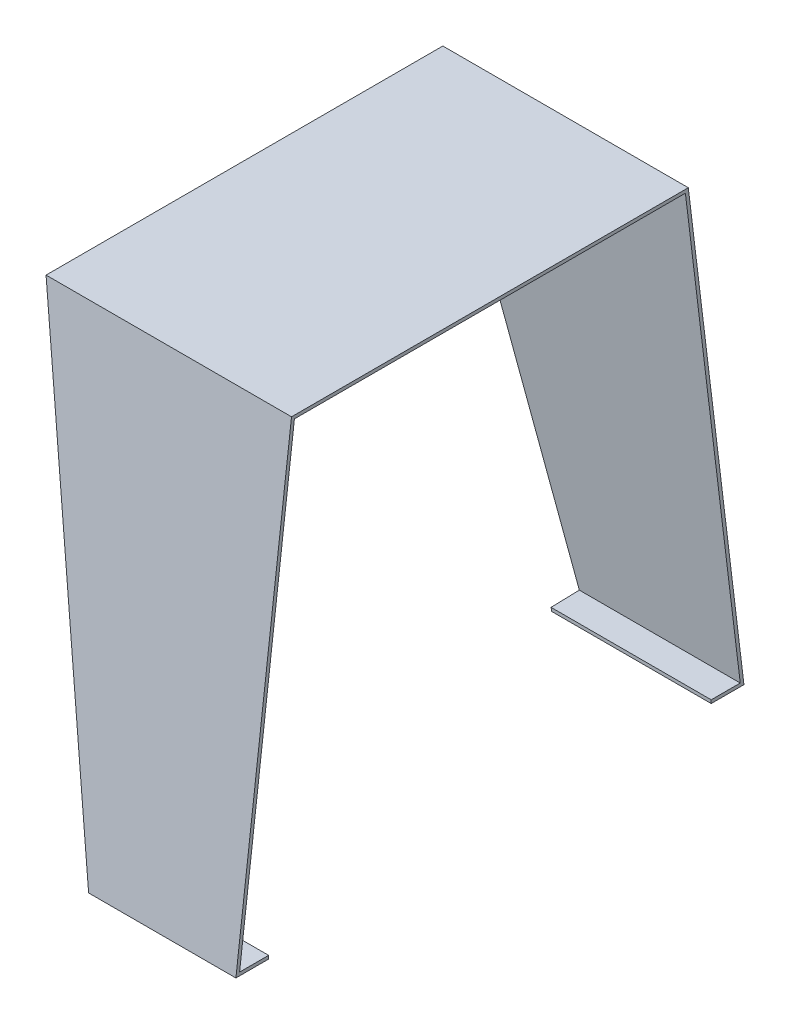
ISO-10303-21;
HEADER;
FILE_DESCRIPTION(('STEP AP214'),'2;1');
FILE_NAME('part.step','',(''),(''),'','','');
FILE_SCHEMA(('AUTOMOTIVE_DESIGN { 1 0 10303 214 1 1 1 1 }'));
ENDSEC;
DATA;
#1=APPLICATION_CONTEXT('core data for automotive mechanical design processes');
#2=APPLICATION_PROTOCOL_DEFINITION('international standard','automotive_design',2000,#1);
#3=PRODUCT_CONTEXT('',#1,'mechanical');
#4=PRODUCT('Part','Part','',(#3));
#5=PRODUCT_RELATED_PRODUCT_CATEGORY('part','',(#4));
#6=PRODUCT_DEFINITION_FORMATION('','',#4);
#7=PRODUCT_DEFINITION_CONTEXT('part definition',#1,'design');
#8=PRODUCT_DEFINITION('design','',#6,#7);
#9=PRODUCT_DEFINITION_SHAPE('','',#8);
#10=(LENGTH_UNIT() NAMED_UNIT(*) SI_UNIT(.MILLI.,.METRE.));
#11=(NAMED_UNIT(*) PLANE_ANGLE_UNIT() SI_UNIT($,.RADIAN.));
#12=(NAMED_UNIT(*) SI_UNIT($,.STERADIAN.) SOLID_ANGLE_UNIT());
#13=UNCERTAINTY_MEASURE_WITH_UNIT(LENGTH_MEASURE(1.E-05),#10,'distance_accuracy_value','');
#14=(GEOMETRIC_REPRESENTATION_CONTEXT(3) GLOBAL_UNCERTAINTY_ASSIGNED_CONTEXT((#13)) GLOBAL_UNIT_ASSIGNED_CONTEXT((#10,
#11,#12)) REPRESENTATION_CONTEXT('',''));
#15=CARTESIAN_POINT('',(0.,0.,0.));
#16=DIRECTION('',(0.,0.,1.));
#17=DIRECTION('',(1.,0.,0.));
#18=AXIS2_PLACEMENT_3D('',#15,#16,#17);
#19=CARTESIAN_POINT('',(150.,-280.,34.));
#20=DIRECTION('',(0.,1.,0.));
#21=DIRECTION('',(0.,0.,1.));
#22=AXIS2_PLACEMENT_3D('',#19,#20,#21);
#23=PLANE('',#22);
#24=DIRECTION('',(0.,0.,-1.));
#25=VECTOR('',#24,1.);
#26=CARTESIAN_POINT('',(150.,-280.,34.));
#27=LINE('',#26,#25);
#28=CARTESIAN_POINT('',(150.,-280.,-256.46));
#29=VERTEX_POINT('',#28);
#30=CARTESIAN_POINT('',(150.,-280.,-276.46));
#31=VERTEX_POINT('',#30);
#32=EDGE_CURVE('E184',#29,#31,#27,.T.);
#33=ORIENTED_EDGE('',*,*,#32,.F.);
#34=DIRECTION('',(1.,0.,0.));
#35=VECTOR('',#34,1.);
#36=CARTESIAN_POINT('',(0.,-280.,-256.46));
#37=LINE('',#36,#35);
#38=CARTESIAN_POINT('',(52.5519332294233,-280.,-256.46));
#39=VERTEX_POINT('',#38);
#40=EDGE_CURVE('E137',#39,#29,#37,.T.);
#41=ORIENTED_EDGE('',*,*,#40,.F.);
#42=DIRECTION('',(-0.0256338887285018,0.,-0.999671397884652));
#43=VECTOR('',#42,1.);
#44=CARTESIAN_POINT('',(60.0591386626211,-280.,36.3062918840597));
#45=LINE('',#44,#43);
#46=CARTESIAN_POINT('',(52.0390869324753,-280.,-276.46));
#47=VERTEX_POINT('',#46);
#48=EDGE_CURVE('E231',#39,#47,#45,.T.);
#49=ORIENTED_EDGE('',*,*,#48,.T.);
#50=DIRECTION('',(-1.,0.,0.));
#51=VECTOR('',#50,1.);
#52=CARTESIAN_POINT('',(150.,-280.,-276.46));
#53=LINE('',#52,#51);
#54=EDGE_CURVE('E194',#31,#47,#53,.T.);
#55=ORIENTED_EDGE('',*,*,#54,.F.);
#56=EDGE_LOOP('',(#33,#41,#49,#55));
#57=FACE_BOUND('',#56,.T.);
#58=ADVANCED_FACE('F33',(#57),#23,.F.);
#59=CARTESIAN_POINT('',(150.,-278.,31.742451915128));
#60=DIRECTION('',(0.,1.,0.));
#61=DIRECTION('',(0.,0.,1.));
#62=AXIS2_PLACEMENT_3D('',#59,#60,#61);
#63=PLANE('',#62);
#64=DIRECTION('',(-1.,0.,0.));
#65=VECTOR('',#64,1.);
#66=CARTESIAN_POINT('',(0.,-278.,-256.46));
#67=LINE('',#66,#65);
#68=CARTESIAN_POINT('',(150.,-278.,-256.46));
#69=VERTEX_POINT('',#68);
#70=CARTESIAN_POINT('',(52.129589220172,-278.,-256.46));
#71=VERTEX_POINT('',#70);
#72=EDGE_CURVE('E56',#69,#71,#67,.T.);
#73=ORIENTED_EDGE('',*,*,#72,.F.);
#74=DIRECTION('',(0.,0.,-1.));
#75=VECTOR('',#74,1.);
#76=CARTESIAN_POINT('',(150.,-278.,31.742451915128));
#77=LINE('',#76,#75);
#78=CARTESIAN_POINT('',(150.,-278.,-274.202451915128));
#79=VERTEX_POINT('',#78);
#80=EDGE_CURVE('E155',#69,#79,#77,.T.);
#81=ORIENTED_EDGE('',*,*,#80,.T.);
#82=DIRECTION('',(-1.,0.,0.));
#83=VECTOR('',#82,1.);
#84=CARTESIAN_POINT('',(150.,-278.,-274.202451915128));
#85=LINE('',#84,#83);
#86=CARTESIAN_POINT('',(51.6746316819994,-278.,-274.202451915128));
#87=VERTEX_POINT('',#86);
#88=EDGE_CURVE('E154',#79,#87,#85,.T.);
#89=ORIENTED_EDGE('',*,*,#88,.T.);
#90=DIRECTION('',(-0.0256338887285018,0.,-0.999671397884652));
#91=VECTOR('',#90,1.);
#92=CARTESIAN_POINT('',(59.5792214537459,-278.,34.0610499873584));
#93=LINE('',#92,#91);
#94=EDGE_CURVE('E41',#71,#87,#93,.T.);
#95=ORIENTED_EDGE('',*,*,#94,.F.);
#96=EDGE_LOOP('',(#73,#81,#89,#95));
#97=FACE_BOUND('',#96,.T.);
#98=ADVANCED_FACE('F221',(#97),#63,.T.);
#99=CARTESIAN_POINT('',(60.,-317.150927648449,-271.948815928403));
#100=DIRECTION('',(0.978114448495998,0.206550388842234,-0.0250811186451284));
#101=DIRECTION('',(-0.206615386062609,0.97842224128553,0.));
#102=AXIS2_PLACEMENT_3D('',#99,#100,#101);
#103=PLANE('',#102);
#104=ORIENTED_EDGE('',*,*,#48,.F.);
#105=DIRECTION('',(0.206615386062609,-0.97842224128553,0.));
#106=VECTOR('',#105,1.);
#107=CARTESIAN_POINT('',(50.3086976789349,-269.377211461033,-256.46));
#108=LINE('',#107,#106);
#109=EDGE_CURVE('E211',#71,#39,#108,.T.);
#110=ORIENTED_EDGE('',*,*,#109,.F.);
#111=ORIENTED_EDGE('',*,*,#94,.T.);
#112=DIRECTION('',(-0.20227182697728,0.972188237006813,0.118051428779399));
#113=VECTOR('',#112,1.);
#114=CARTESIAN_POINT('',(55.6975051811138,-297.335318977688,-276.550312076704));
#115=LINE('',#114,#113);
#116=CARTESIAN_POINT('',(0.,-29.6338789062195,-244.043708639455));
#117=VERTEX_POINT('',#116);
#118=EDGE_CURVE('E209',#87,#117,#115,.T.);
#119=ORIENTED_EDGE('',*,*,#118,.T.);
#120=DIRECTION('',(0.,0.120543125395831,0.99270809149508));
#121=VECTOR('',#120,1.);
#122=CARTESIAN_POINT('',(0.,-37.1509276484489,-305.948815928403));
#123=LINE('',#122,#121);
#124=CARTESIAN_POINT('',(0.,-29.8821811402827,-246.088550567034));
#125=VERTEX_POINT('',#124);
#126=EDGE_CURVE('E237',#125,#117,#123,.T.);
#127=ORIENTED_EDGE('',*,*,#126,.F.);
#128=DIRECTION('',(-0.20227182697728,0.972188237006813,0.118051428779398));
#129=VECTOR('',#128,1.);
#130=CARTESIAN_POINT('',(56.047049148837,-299.263650204496,-278.799157524832));
#131=LINE('',#130,#129);
#132=EDGE_CURVE('E218',#47,#125,#131,.T.);
#133=ORIENTED_EDGE('',*,*,#132,.F.);
#134=EDGE_LOOP('',(#104,#110,#111,#119,#127,#133));
#135=FACE_BOUND('',#134,.T.);
#136=ADVANCED_FACE('F208',(#135),#103,.F.);
#137=CARTESIAN_POINT('',(150.,0.,0.));
#138=DIRECTION('',(1.,0.,0.));
#139=DIRECTION('',(0.,0.,-1.));
#140=AXIS2_PLACEMENT_3D('',#137,#138,#139);
#141=PLANE('',#140);
#142=DIRECTION('',(0.,1.,0.));
#143=VECTOR('',#142,1.);
#144=CARTESIAN_POINT('',(150.,-280.001,-256.46));
#145=LINE('',#144,#143);
#146=EDGE_CURVE('E148',#29,#69,#145,.T.);
#147=ORIENTED_EDGE('',*,*,#146,.F.);
#148=ORIENTED_EDGE('',*,*,#32,.T.);
#149=DIRECTION('',(0.,0.992708091495081,0.120543125395831));
#150=VECTOR('',#149,1.);
#151=CARTESIAN_POINT('',(150.,-280.,-276.46));
#152=LINE('',#151,#150);
#153=CARTESIAN_POINT('',(150.,0.,-242.46));
#154=VERTEX_POINT('',#153);
#155=EDGE_CURVE('E186',#31,#154,#152,.T.);
#156=ORIENTED_EDGE('',*,*,#155,.T.);
#157=DIRECTION('',(0.,0.,1.));
#158=VECTOR('',#157,1.);
#159=CARTESIAN_POINT('',(150.,0.,-242.46));
#160=LINE('',#159,#158);
#161=CARTESIAN_POINT('',(150.,0.,0.));
#162=VERTEX_POINT('',#161);
#163=EDGE_CURVE('E178',#154,#162,#160,.T.);
#164=ORIENTED_EDGE('',*,*,#163,.T.);
#165=DIRECTION('',(0.,-0.99270809149508,0.120543125395831));
#166=VECTOR('',#165,1.);
#167=CARTESIAN_POINT('',(150.,0.,0.));
#168=LINE('',#167,#166);
#169=CARTESIAN_POINT('',(150.,-280.,34.));
#170=VERTEX_POINT('',#169);
#171=EDGE_CURVE('E181',#162,#170,#168,.T.);
#172=ORIENTED_EDGE('',*,*,#171,.T.);
#173=CARTESIAN_POINT('',(150.,-280.,14.));
#174=VERTEX_POINT('',#173);
#175=EDGE_CURVE('E147',#170,#174,#27,.T.);
#176=ORIENTED_EDGE('',*,*,#175,.T.);
#177=DIRECTION('',(0.,1.,0.));
#178=VECTOR('',#177,1.);
#179=CARTESIAN_POINT('',(150.,-280.001,14.));
#180=LINE('',#179,#178);
#181=CARTESIAN_POINT('',(150.,-278.,14.));
#182=VERTEX_POINT('',#181);
#183=EDGE_CURVE('E132',#174,#182,#180,.T.);
#184=ORIENTED_EDGE('',*,*,#183,.T.);
#185=CARTESIAN_POINT('',(150.,-278.,31.742451915128));
#186=VERTEX_POINT('',#185);
#187=EDGE_CURVE('E145',#186,#182,#77,.T.);
#188=ORIENTED_EDGE('',*,*,#187,.F.);
#189=DIRECTION('',(0.,-0.99270809149508,0.120543125395831));
#190=VECTOR('',#189,1.);
#191=CARTESIAN_POINT('',(150.,-2.,-1.77183379915767));
#192=LINE('',#191,#190);
#193=CARTESIAN_POINT('',(150.,-2.,-1.77183379915767));
#194=VERTEX_POINT('',#193);
#195=EDGE_CURVE('E159',#194,#186,#192,.T.);
#196=ORIENTED_EDGE('',*,*,#195,.F.);
#197=DIRECTION('',(0.,0.,1.));
#198=VECTOR('',#197,1.);
#199=CARTESIAN_POINT('',(150.,-2.,-240.688166200842));
#200=LINE('',#199,#198);
#201=CARTESIAN_POINT('',(150.,-2.,-240.688166200842));
#202=VERTEX_POINT('',#201);
#203=EDGE_CURVE('E225',#202,#194,#200,.T.);
#204=ORIENTED_EDGE('',*,*,#203,.F.);
#205=DIRECTION('',(0.,0.99270809149508,0.120543125395831));
#206=VECTOR('',#205,1.);
#207=CARTESIAN_POINT('',(150.,-278.,-274.202451915128));
#208=LINE('',#207,#206);
#209=EDGE_CURVE('E168',#79,#202,#208,.T.);
#210=ORIENTED_EDGE('',*,*,#209,.F.);
#211=ORIENTED_EDGE('',*,*,#80,.F.);
#212=EDGE_LOOP('',(#147,#148,#156,#164,#172,#176,#184,#188,#196,#204,#210,#211));
#213=FACE_BOUND('',#212,.T.);
#214=ADVANCED_FACE('F143',(#213),#141,.T.);
#215=CARTESIAN_POINT('',(0.,0.,0.));
#216=DIRECTION('',(1.,0.,0.));
#217=DIRECTION('',(0.,0.,-1.));
#218=AXIS2_PLACEMENT_3D('',#215,#216,#217);
#219=PLANE('',#218);
#220=DIRECTION('',(0.,0.992708091495081,0.120543125395831));
#221=VECTOR('',#220,1.);
#222=CARTESIAN_POINT('',(0.,-280.,-276.46));
#223=LINE('',#222,#221);
#224=CARTESIAN_POINT('',(0.,0.,-242.46));
#225=VERTEX_POINT('',#224);
#226=EDGE_CURVE('E182',#125,#225,#223,.T.);
#227=ORIENTED_EDGE('',*,*,#226,.F.);
#228=ORIENTED_EDGE('',*,*,#126,.T.);
#229=DIRECTION('',(0.,0.99270809149508,0.120543125395831));
#230=VECTOR('',#229,1.);
#231=CARTESIAN_POINT('',(0.,-278.,-274.202451915128));
#232=LINE('',#231,#230);
#233=CARTESIAN_POINT('',(0.,-2.,-240.688166200842));
#234=VERTEX_POINT('',#233);
#235=EDGE_CURVE('E163',#117,#234,#232,.T.);
#236=ORIENTED_EDGE('',*,*,#235,.T.);
#237=DIRECTION('',(0.,0.,1.));
#238=VECTOR('',#237,1.);
#239=CARTESIAN_POINT('',(0.,-2.,-240.688166200842));
#240=LINE('',#239,#238);
#241=CARTESIAN_POINT('',(0.,-2.00000000000002,-16.4705882352945));
#242=VERTEX_POINT('',#241);
#243=EDGE_CURVE('E165',#234,#242,#240,.T.);
#244=ORIENTED_EDGE('',*,*,#243,.T.);
#245=CARTESIAN_POINT('',(0.,0.,0.));
#246=VERTEX_POINT('',#245);
#247=EDGE_CURVE('E238',#242,#246,#123,.T.);
#248=ORIENTED_EDGE('',*,*,#247,.T.);
#249=DIRECTION('',(0.,0.,1.));
#250=VECTOR('',#249,1.);
#251=CARTESIAN_POINT('',(0.,0.,-242.46));
#252=LINE('',#251,#250);
#253=EDGE_CURVE('E177',#225,#246,#252,.T.);
#254=ORIENTED_EDGE('',*,*,#253,.F.);
#255=EDGE_LOOP('',(#227,#228,#236,#244,#248,#254));
#256=FACE_BOUND('',#255,.T.);
#257=ADVANCED_FACE('F263',(#256),#219,.F.);
#258=CARTESIAN_POINT('',(150.,0.,-242.46));
#259=DIRECTION('',(0.,-1.,0.));
#260=DIRECTION('',(0.,0.,-1.));
#261=AXIS2_PLACEMENT_3D('',#258,#259,#260);
#262=PLANE('',#261);
#263=ORIENTED_EDGE('',*,*,#253,.T.);
#264=DIRECTION('',(-1.,0.,0.));
#265=VECTOR('',#264,1.);
#266=CARTESIAN_POINT('',(150.,0.,0.));
#267=LINE('',#266,#265);
#268=EDGE_CURVE('E199',#162,#246,#267,.T.);
#269=ORIENTED_EDGE('',*,*,#268,.F.);
#270=ORIENTED_EDGE('',*,*,#163,.F.);
#271=DIRECTION('',(-1.,0.,0.));
#272=VECTOR('',#271,1.);
#273=CARTESIAN_POINT('',(150.,0.,-242.46));
#274=LINE('',#273,#272);
#275=EDGE_CURVE('E188',#154,#225,#274,.T.);
#276=ORIENTED_EDGE('',*,*,#275,.T.);
#277=EDGE_LOOP('',(#263,#269,#270,#276));
#278=FACE_BOUND('',#277,.T.);
#279=ADVANCED_FACE('F35',(#278),#262,.F.);
#280=CARTESIAN_POINT('',(150.,0.,0.));
#281=DIRECTION('',(0.,-0.120543125395831,-0.99270809149508));
#282=DIRECTION('',(0.,0.992708091495081,-0.120543125395831));
#283=AXIS2_PLACEMENT_3D('',#280,#281,#282);
#284=PLANE('',#283);
#285=ORIENTED_EDGE('',*,*,#268,.T.);
#286=DIRECTION('',(-0.208067598735048,0.970982127430226,-0.117904972616527));
#287=VECTOR('',#286,1.);
#288=CARTESIAN_POINT('',(60.,-280.,34.));
#289=LINE('',#288,#287);
#290=CARTESIAN_POINT('',(60.,-280.,34.));
#291=VERTEX_POINT('',#290);
#292=EDGE_CURVE('E241',#291,#246,#289,.T.);
#293=ORIENTED_EDGE('',*,*,#292,.F.);
#294=DIRECTION('',(-1.,0.,0.));
#295=VECTOR('',#294,1.);
#296=CARTESIAN_POINT('',(150.,-280.,34.));
#297=LINE('',#296,#295);
#298=EDGE_CURVE('E197',#170,#291,#297,.T.);
#299=ORIENTED_EDGE('',*,*,#298,.F.);
#300=ORIENTED_EDGE('',*,*,#171,.F.);
#301=EDGE_LOOP('',(#285,#293,#299,#300));
#302=FACE_BOUND('',#301,.T.);
#303=ADVANCED_FACE('F276',(#302),#284,.F.);
#304=CARTESIAN_POINT('',(59.4871537030519,-280.,14.));
#305=VERTEX_POINT('',#304);
#306=EDGE_CURVE('E166',#291,#305,#45,.T.);
#307=ORIENTED_EDGE('',*,*,#306,.T.);
#308=DIRECTION('',(-1.,0.,0.));
#309=VECTOR('',#308,1.);
#310=CARTESIAN_POINT('',(0.,-280.,14.));
#311=LINE('',#310,#309);
#312=EDGE_CURVE('E48',#174,#305,#311,.T.);
#313=ORIENTED_EDGE('',*,*,#312,.F.);
#314=ORIENTED_EDGE('',*,*,#175,.F.);
#315=ORIENTED_EDGE('',*,*,#298,.T.);
#316=EDGE_LOOP('',(#307,#313,#314,#315));
#317=FACE_BOUND('',#316,.T.);
#318=ADVANCED_FACE('F275',(#317),#23,.F.);
#319=CARTESIAN_POINT('',(150.,-280.,-276.46));
#320=DIRECTION('',(0.,-0.120543125395831,0.99270809149508));
#321=DIRECTION('',(0.,-0.99270809149508,-0.120543125395831));
#322=AXIS2_PLACEMENT_3D('',#319,#320,#321);
#323=PLANE('',#322);
#324=ORIENTED_EDGE('',*,*,#54,.T.);
#325=ORIENTED_EDGE('',*,*,#132,.T.);
#326=ORIENTED_EDGE('',*,*,#226,.T.);
#327=ORIENTED_EDGE('',*,*,#275,.F.);
#328=ORIENTED_EDGE('',*,*,#155,.F.);
#329=EDGE_LOOP('',(#324,#325,#326,#327,#328));
#330=FACE_BOUND('',#329,.T.);
#331=ADVANCED_FACE('F256',(#330),#323,.F.);
#332=CARTESIAN_POINT('',(150.,-278.,-274.202451915128));
#333=DIRECTION('',(0.,-0.120543125395831,0.99270809149508));
#334=DIRECTION('',(0.,-0.992708091495081,-0.120543125395831));
#335=AXIS2_PLACEMENT_3D('',#332,#333,#334);
#336=PLANE('',#335);
#337=ORIENTED_EDGE('',*,*,#118,.F.);
#338=ORIENTED_EDGE('',*,*,#88,.F.);
#339=ORIENTED_EDGE('',*,*,#209,.T.);
#340=DIRECTION('',(-1.,0.,0.));
#341=VECTOR('',#340,1.);
#342=CARTESIAN_POINT('',(150.,-2.,-240.688166200842));
#343=LINE('',#342,#341);
#344=EDGE_CURVE('E174',#202,#234,#343,.T.);
#345=ORIENTED_EDGE('',*,*,#344,.T.);
#346=ORIENTED_EDGE('',*,*,#235,.F.);
#347=EDGE_LOOP('',(#337,#338,#339,#345,#346));
#348=FACE_BOUND('',#347,.T.);
#349=ADVANCED_FACE('F216',(#348),#336,.T.);
#350=CARTESIAN_POINT('',(150.,-2.,-240.688166200842));
#351=DIRECTION('',(0.,-1.,0.));
#352=DIRECTION('',(0.,0.,-1.));
#353=AXIS2_PLACEMENT_3D('',#350,#351,#352);
#354=PLANE('',#353);
#355=DIRECTION('',(0.0256338887285018,0.,0.999671397884652));
#356=VECTOR('',#355,1.);
#357=CARTESIAN_POINT('',(-5.64711534369228,-2.,-236.697013864109));
#358=LINE('',#357,#356);
#359=CARTESIAN_POINT('',(0.376910089116089,-2.,-1.77183379915767));
#360=VERTEX_POINT('',#359);
#361=EDGE_CURVE('E219',#242,#360,#358,.T.);
#362=ORIENTED_EDGE('',*,*,#361,.F.);
#363=ORIENTED_EDGE('',*,*,#243,.F.);
#364=ORIENTED_EDGE('',*,*,#344,.F.);
#365=ORIENTED_EDGE('',*,*,#203,.T.);
#366=DIRECTION('',(-1.,0.,0.));
#367=VECTOR('',#366,1.);
#368=CARTESIAN_POINT('',(150.,-2.,-1.77183379915767));
#369=LINE('',#368,#367);
#370=EDGE_CURVE('E171',#194,#360,#369,.T.);
#371=ORIENTED_EDGE('',*,*,#370,.T.);
#372=EDGE_LOOP('',(#362,#363,#364,#365,#371));
#373=FACE_BOUND('',#372,.T.);
#374=ADVANCED_FACE('F270',(#373),#354,.T.);
#375=CARTESIAN_POINT('',(150.,-2.,-1.77183379915767));
#376=DIRECTION('',(0.,-0.120543125395831,-0.99270809149508));
#377=DIRECTION('',(0.,0.992708091495081,-0.120543125395831));
#378=AXIS2_PLACEMENT_3D('',#375,#376,#377);
#379=PLANE('',#378);
#380=DIRECTION('',(0.208067598735048,-0.970982127430226,0.117904972616527));
#381=VECTOR('',#380,1.);
#382=CARTESIAN_POINT('',(6.85441169668719,-32.2283408353318,1.89875044513261));
#383=LINE('',#382,#381);
#384=CARTESIAN_POINT('',(59.5197672319732,-278.,31.742451915128));
#385=VERTEX_POINT('',#384);
#386=EDGE_CURVE('E235',#360,#385,#383,.T.);
#387=ORIENTED_EDGE('',*,*,#386,.F.);
#388=ORIENTED_EDGE('',*,*,#370,.F.);
#389=ORIENTED_EDGE('',*,*,#195,.T.);
#390=DIRECTION('',(-1.,0.,0.));
#391=VECTOR('',#390,1.);
#392=CARTESIAN_POINT('',(150.,-278.,31.742451915128));
#393=LINE('',#392,#391);
#394=EDGE_CURVE('E152',#186,#385,#393,.T.);
#395=ORIENTED_EDGE('',*,*,#394,.T.);
#396=EDGE_LOOP('',(#387,#388,#389,#395));
#397=FACE_BOUND('',#396,.T.);
#398=ADVANCED_FACE('F273',(#397),#379,.T.);
#399=DIRECTION('',(1.,0.,0.));
#400=VECTOR('',#399,1.);
#401=CARTESIAN_POINT('',(0.,-278.,14.));
#402=LINE('',#401,#400);
#403=CARTESIAN_POINT('',(59.0648096938006,-278.,14.));
#404=VERTEX_POINT('',#403);
#405=EDGE_CURVE('E129',#404,#182,#402,.T.);
#406=ORIENTED_EDGE('',*,*,#405,.F.);
#407=EDGE_CURVE('E11',#385,#404,#93,.T.);
#408=ORIENTED_EDGE('',*,*,#407,.F.);
#409=ORIENTED_EDGE('',*,*,#394,.F.);
#410=ORIENTED_EDGE('',*,*,#187,.T.);
#411=EDGE_LOOP('',(#406,#408,#409,#410));
#412=FACE_BOUND('',#411,.T.);
#413=ADVANCED_FACE('F150',(#412),#63,.T.);
#414=ORIENTED_EDGE('',*,*,#407,.T.);
#415=DIRECTION('',(-0.206615386062609,0.97842224128553,0.));
#416=VECTOR('',#415,1.);
#417=CARTESIAN_POINT('',(56.9478541609121,-267.97520747771,14.));
#418=LINE('',#417,#416);
#419=EDGE_CURVE('E133',#305,#404,#418,.T.);
#420=ORIENTED_EDGE('',*,*,#419,.F.);
#421=ORIENTED_EDGE('',*,*,#306,.F.);
#422=ORIENTED_EDGE('',*,*,#292,.T.);
#423=ORIENTED_EDGE('',*,*,#247,.F.);
#424=ORIENTED_EDGE('',*,*,#361,.T.);
#425=ORIENTED_EDGE('',*,*,#386,.T.);
#426=EDGE_LOOP('',(#414,#420,#421,#422,#423,#424,#425));
#427=FACE_BOUND('',#426,.T.);
#428=ADVANCED_FACE('F267',(#427),#103,.F.);
#429=CARTESIAN_POINT('',(0.,-280.001,14.));
#430=DIRECTION('',(0.,0.,1.));
#431=DIRECTION('',(1.,0.,0.));
#432=AXIS2_PLACEMENT_3D('',#429,#430,#431);
#433=PLANE('',#432);
#434=ORIENTED_EDGE('',*,*,#312,.T.);
#435=ORIENTED_EDGE('',*,*,#419,.T.);
#436=ORIENTED_EDGE('',*,*,#405,.T.);
#437=ORIENTED_EDGE('',*,*,#183,.F.);
#438=EDGE_LOOP('',(#434,#435,#436,#437));
#439=FACE_BOUND('',#438,.T.);
#440=ADVANCED_FACE('F131',(#439),#433,.F.);
#441=CARTESIAN_POINT('',(0.,-280.001,-256.46));
#442=DIRECTION('',(0.,0.,-1.));
#443=DIRECTION('',(-1.,0.,0.));
#444=AXIS2_PLACEMENT_3D('',#441,#442,#443);
#445=PLANE('',#444);
#446=ORIENTED_EDGE('',*,*,#40,.T.);
#447=ORIENTED_EDGE('',*,*,#146,.T.);
#448=ORIENTED_EDGE('',*,*,#72,.T.);
#449=ORIENTED_EDGE('',*,*,#109,.T.);
#450=EDGE_LOOP('',(#446,#447,#448,#449));
#451=FACE_BOUND('',#450,.T.);
#452=ADVANCED_FACE('F249',(#451),#445,.F.);
#453=CLOSED_SHELL('',(#58,#98,#136,#214,#257,#279,#303,#318,#331,#349,#374,#398,#413,#428,#440,#452));
#454=MANIFOLD_SOLID_BREP('B2',#453);
#455=ADVANCED_BREP_SHAPE_REPRESENTATION('',(#18,#454),#14);
#456=SHAPE_DEFINITION_REPRESENTATION(#9,#455);
ENDSEC;
END-ISO-10303-21;
